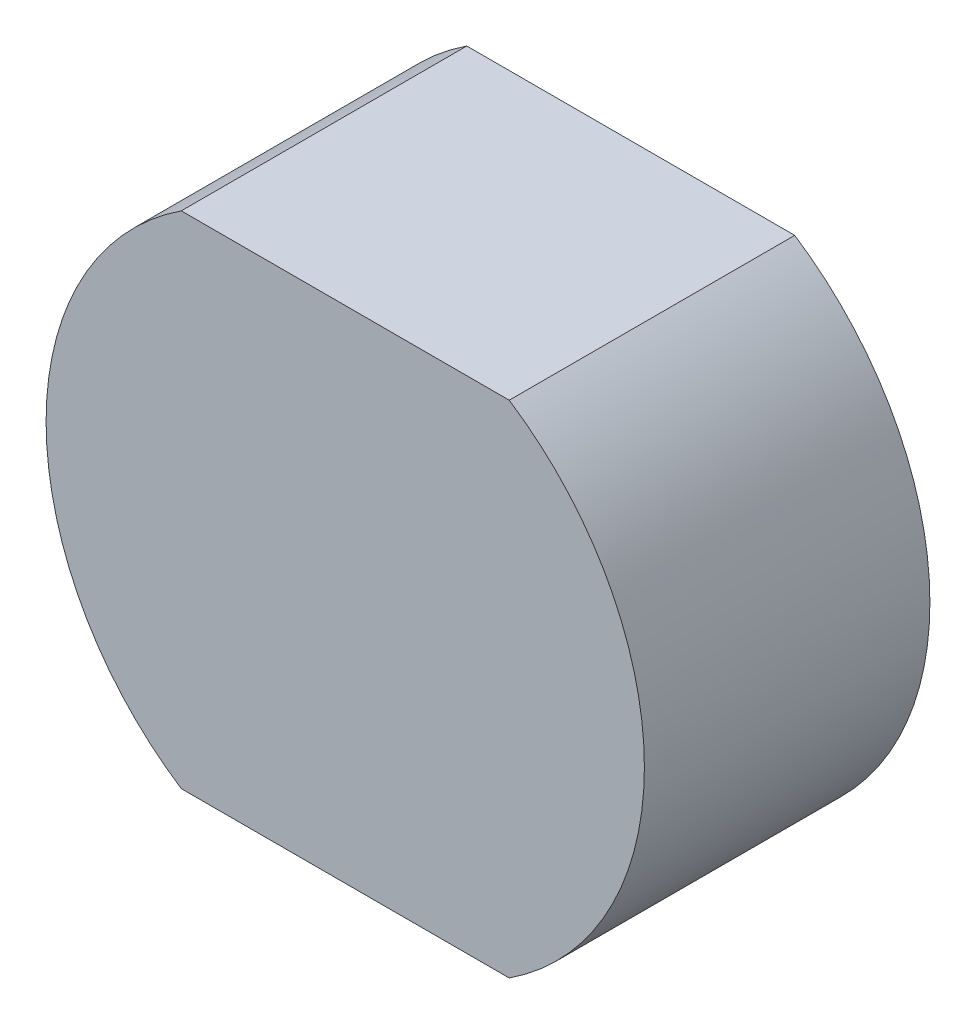
ISO-10303-21;
HEADER;
FILE_DESCRIPTION(('STEP AP214'),'2;1');
FILE_NAME('part.step','',(''),(''),'','','');
FILE_SCHEMA(('AUTOMOTIVE_DESIGN { 1 0 10303 214 1 1 1 1 }'));
ENDSEC;
DATA;
#1=APPLICATION_CONTEXT('core data for automotive mechanical design processes');
#2=APPLICATION_PROTOCOL_DEFINITION('international standard','automotive_design',2000,#1);
#3=PRODUCT_CONTEXT('',#1,'mechanical');
#4=PRODUCT('Part','Part','',(#3));
#5=PRODUCT_RELATED_PRODUCT_CATEGORY('part','',(#4));
#6=PRODUCT_DEFINITION_FORMATION('','',#4);
#7=PRODUCT_DEFINITION_CONTEXT('part definition',#1,'design');
#8=PRODUCT_DEFINITION('design','',#6,#7);
#9=PRODUCT_DEFINITION_SHAPE('','',#8);
#10=(LENGTH_UNIT() NAMED_UNIT(*) SI_UNIT(.MILLI.,.METRE.));
#11=(NAMED_UNIT(*) PLANE_ANGLE_UNIT() SI_UNIT($,.RADIAN.));
#12=(NAMED_UNIT(*) SI_UNIT($,.STERADIAN.) SOLID_ANGLE_UNIT());
#13=UNCERTAINTY_MEASURE_WITH_UNIT(LENGTH_MEASURE(1.E-05),#10,'distance_accuracy_value','');
#14=(GEOMETRIC_REPRESENTATION_CONTEXT(3) GLOBAL_UNCERTAINTY_ASSIGNED_CONTEXT((#13)) GLOBAL_UNIT_ASSIGNED_CONTEXT((#10,
#11,#12)) REPRESENTATION_CONTEXT('',''));
#15=CARTESIAN_POINT('',(0.,0.,0.));
#16=DIRECTION('',(0.,0.,1.));
#17=DIRECTION('',(1.,0.,0.));
#18=AXIS2_PLACEMENT_3D('',#15,#16,#17);
#19=CARTESIAN_POINT('',(0.,0.,-1.));
#20=DIRECTION('',(0.,0.,1.));
#21=DIRECTION('',(1.,0.,0.));
#22=AXIS2_PLACEMENT_3D('',#19,#20,#21);
#23=CYLINDRICAL_SURFACE('',#22,2.0955);
#24=DIRECTION('',(0.,0.,1.));
#25=VECTOR('',#24,1.);
#26=CARTESIAN_POINT('',(-1.14870078349412,-1.7526,-1.));
#27=LINE('',#26,#25);
#28=CARTESIAN_POINT('',(-1.14870078349412,-1.7526,-1.));
#29=VERTEX_POINT('',#28);
#30=CARTESIAN_POINT('',(-1.14870078349412,-1.7526,1.));
#31=VERTEX_POINT('',#30);
#32=EDGE_CURVE('E37',#29,#31,#27,.T.);
#33=ORIENTED_EDGE('',*,*,#32,.T.);
#34=CARTESIAN_POINT('',(0.,0.,1.));
#35=DIRECTION('',(0.,0.,1.));
#36=DIRECTION('',(1.,0.,0.));
#37=AXIS2_PLACEMENT_3D('',#34,#35,#36);
#38=CIRCLE('',#37,2.0955);
#39=CARTESIAN_POINT('',(-1.14870078349412,1.7526,1.));
#40=VERTEX_POINT('',#39);
#41=EDGE_CURVE('E74',#40,#31,#38,.T.);
#42=ORIENTED_EDGE('',*,*,#41,.F.);
#43=DIRECTION('',(0.,0.,1.));
#44=VECTOR('',#43,1.);
#45=CARTESIAN_POINT('',(-1.14870078349412,1.7526,-1.));
#46=LINE('',#45,#44);
#47=CARTESIAN_POINT('',(-1.14870078349412,1.7526,-1.));
#48=VERTEX_POINT('',#47);
#49=EDGE_CURVE('E11',#48,#40,#46,.T.);
#50=ORIENTED_EDGE('',*,*,#49,.F.);
#51=CARTESIAN_POINT('',(0.,0.,-1.));
#52=DIRECTION('',(0.,0.,1.));
#53=DIRECTION('',(1.,0.,0.));
#54=AXIS2_PLACEMENT_3D('',#51,#52,#53);
#55=CIRCLE('',#54,2.0955);
#56=EDGE_CURVE('E75',#48,#29,#55,.T.);
#57=ORIENTED_EDGE('',*,*,#56,.T.);
#58=EDGE_LOOP('',(#33,#42,#50,#57));
#59=FACE_BOUND('',#58,.T.);
#60=ADVANCED_FACE('F34',(#59),#23,.T.);
#61=CARTESIAN_POINT('',(-1.14870078349412,1.7526,-1.));
#62=DIRECTION('',(0.,1.,0.));
#63=DIRECTION('',(0.,0.,1.));
#64=AXIS2_PLACEMENT_3D('',#61,#62,#63);
#65=PLANE('',#64);
#66=ORIENTED_EDGE('',*,*,#49,.T.);
#67=DIRECTION('',(-1.,0.,0.));
#68=VECTOR('',#67,1.);
#69=CARTESIAN_POINT('',(-1.14870078349412,1.7526,1.));
#70=LINE('',#69,#68);
#71=CARTESIAN_POINT('',(1.14870078349412,1.7526,1.));
#72=VERTEX_POINT('',#71);
#73=EDGE_CURVE('E91',#72,#40,#70,.T.);
#74=ORIENTED_EDGE('',*,*,#73,.F.);
#75=DIRECTION('',(0.,0.,1.));
#76=VECTOR('',#75,1.);
#77=CARTESIAN_POINT('',(1.14870078349412,1.7526,-1.));
#78=LINE('',#77,#76);
#79=CARTESIAN_POINT('',(1.14870078349412,1.7526,-1.));
#80=VERTEX_POINT('',#79);
#81=EDGE_CURVE('E42',#80,#72,#78,.T.);
#82=ORIENTED_EDGE('',*,*,#81,.F.);
#83=DIRECTION('',(-1.,0.,0.));
#84=VECTOR('',#83,1.);
#85=CARTESIAN_POINT('',(-1.14870078349412,1.7526,-1.));
#86=LINE('',#85,#84);
#87=EDGE_CURVE('E80',#80,#48,#86,.T.);
#88=ORIENTED_EDGE('',*,*,#87,.T.);
#89=EDGE_LOOP('',(#66,#74,#82,#88));
#90=FACE_BOUND('',#89,.T.);
#91=ADVANCED_FACE('F106',(#90),#65,.T.);
#92=CARTESIAN_POINT('',(0.,0.,-1.));
#93=DIRECTION('',(0.,0.,1.));
#94=DIRECTION('',(1.,0.,0.));
#95=AXIS2_PLACEMENT_3D('',#92,#93,#94);
#96=CYLINDRICAL_SURFACE('',#95,2.0955);
#97=ORIENTED_EDGE('',*,*,#81,.T.);
#98=CARTESIAN_POINT('',(0.,0.,1.));
#99=DIRECTION('',(0.,0.,1.));
#100=DIRECTION('',(1.,0.,0.));
#101=AXIS2_PLACEMENT_3D('',#98,#99,#100);
#102=CIRCLE('',#101,2.0955);
#103=CARTESIAN_POINT('',(1.14870078349412,-1.7526,1.));
#104=VERTEX_POINT('',#103);
#105=EDGE_CURVE('E87',#104,#72,#102,.T.);
#106=ORIENTED_EDGE('',*,*,#105,.F.);
#107=DIRECTION('',(0.,0.,1.));
#108=VECTOR('',#107,1.);
#109=CARTESIAN_POINT('',(1.14870078349412,-1.7526,-1.));
#110=LINE('',#109,#108);
#111=CARTESIAN_POINT('',(1.14870078349412,-1.7526,-1.));
#112=VERTEX_POINT('',#111);
#113=EDGE_CURVE('E79',#112,#104,#110,.T.);
#114=ORIENTED_EDGE('',*,*,#113,.F.);
#115=CARTESIAN_POINT('',(0.,0.,-1.));
#116=DIRECTION('',(0.,0.,1.));
#117=DIRECTION('',(1.,0.,0.));
#118=AXIS2_PLACEMENT_3D('',#115,#116,#117);
#119=CIRCLE('',#118,2.0955);
#120=EDGE_CURVE('E99',#112,#80,#119,.T.);
#121=ORIENTED_EDGE('',*,*,#120,.T.);
#122=EDGE_LOOP('',(#97,#106,#114,#121));
#123=FACE_BOUND('',#122,.T.);
#124=ADVANCED_FACE('F103',(#123),#96,.T.);
#125=CARTESIAN_POINT('',(-1.14870078349412,-1.7526,-1.));
#126=DIRECTION('',(0.,-1.,0.));
#127=DIRECTION('',(0.,0.,-1.));
#128=AXIS2_PLACEMENT_3D('',#125,#126,#127);
#129=PLANE('',#128);
#130=ORIENTED_EDGE('',*,*,#113,.T.);
#131=DIRECTION('',(1.,0.,0.));
#132=VECTOR('',#131,1.);
#133=CARTESIAN_POINT('',(-1.14870078349412,-1.7526,1.));
#134=LINE('',#133,#132);
#135=EDGE_CURVE('E82',#31,#104,#134,.T.);
#136=ORIENTED_EDGE('',*,*,#135,.F.);
#137=ORIENTED_EDGE('',*,*,#32,.F.);
#138=DIRECTION('',(1.,0.,0.));
#139=VECTOR('',#138,1.);
#140=CARTESIAN_POINT('',(-1.14870078349412,-1.7526,-1.));
#141=LINE('',#140,#139);
#142=EDGE_CURVE('E97',#29,#112,#141,.T.);
#143=ORIENTED_EDGE('',*,*,#142,.T.);
#144=EDGE_LOOP('',(#130,#136,#137,#143));
#145=FACE_BOUND('',#144,.T.);
#146=ADVANCED_FACE('F83',(#145),#129,.T.);
#147=CARTESIAN_POINT('',(0.,0.,-1.));
#148=DIRECTION('',(0.,0.,1.));
#149=DIRECTION('',(1.,0.,0.));
#150=AXIS2_PLACEMENT_3D('',#147,#148,#149);
#151=PLANE('',#150);
#152=ORIENTED_EDGE('',*,*,#56,.F.);
#153=ORIENTED_EDGE('',*,*,#87,.F.);
#154=ORIENTED_EDGE('',*,*,#120,.F.);
#155=ORIENTED_EDGE('',*,*,#142,.F.);
#156=EDGE_LOOP('',(#152,#153,#154,#155));
#157=FACE_BOUND('',#156,.T.);
#158=ADVANCED_FACE('F108',(#157),#151,.F.);
#159=CARTESIAN_POINT('',(0.,0.,1.));
#160=DIRECTION('',(0.,0.,1.));
#161=DIRECTION('',(1.,0.,0.));
#162=AXIS2_PLACEMENT_3D('',#159,#160,#161);
#163=PLANE('',#162);
#164=ORIENTED_EDGE('',*,*,#41,.T.);
#165=ORIENTED_EDGE('',*,*,#135,.T.);
#166=ORIENTED_EDGE('',*,*,#105,.T.);
#167=ORIENTED_EDGE('',*,*,#73,.T.);
#168=EDGE_LOOP('',(#164,#165,#166,#167));
#169=FACE_BOUND('',#168,.T.);
#170=ADVANCED_FACE('F90',(#169),#163,.T.);
#171=CLOSED_SHELL('',(#60,#91,#124,#146,#158,#170));
#172=MANIFOLD_SOLID_BREP('B2',#171);
#173=ADVANCED_BREP_SHAPE_REPRESENTATION('',(#18,#172),#14);
#174=SHAPE_DEFINITION_REPRESENTATION(#9,#173);
ENDSEC;
END-ISO-10303-21;
